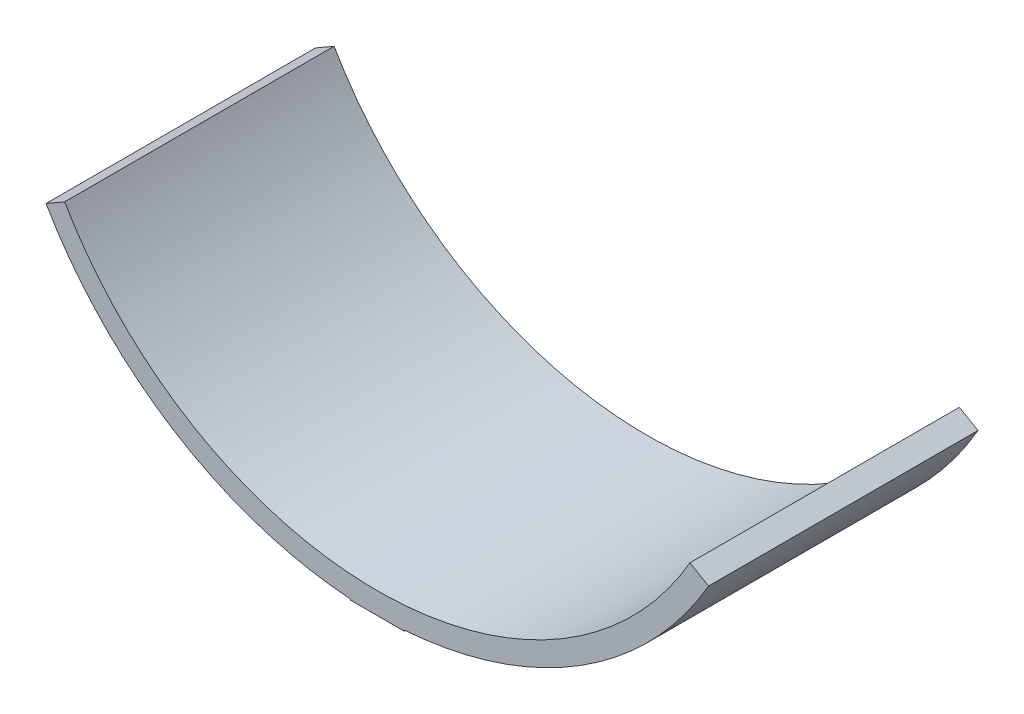
ISO-10303-21;
HEADER;
FILE_DESCRIPTION(('STEP AP214'),'2;1');
FILE_NAME('part.step','',(''),(''),'','','');
FILE_SCHEMA(('AUTOMOTIVE_DESIGN { 1 0 10303 214 1 1 1 1 }'));
ENDSEC;
DATA;
#1=APPLICATION_CONTEXT('core data for automotive mechanical design processes');
#2=APPLICATION_PROTOCOL_DEFINITION('international standard','automotive_design',2000,#1);
#3=PRODUCT_CONTEXT('',#1,'mechanical');
#4=PRODUCT('Part','Part','',(#3));
#5=PRODUCT_RELATED_PRODUCT_CATEGORY('part','',(#4));
#6=PRODUCT_DEFINITION_FORMATION('','',#4);
#7=PRODUCT_DEFINITION_CONTEXT('part definition',#1,'design');
#8=PRODUCT_DEFINITION('design','',#6,#7);
#9=PRODUCT_DEFINITION_SHAPE('','',#8);
#10=(LENGTH_UNIT() NAMED_UNIT(*) SI_UNIT(.MILLI.,.METRE.));
#11=(NAMED_UNIT(*) PLANE_ANGLE_UNIT() SI_UNIT($,.RADIAN.));
#12=(NAMED_UNIT(*) SI_UNIT($,.STERADIAN.) SOLID_ANGLE_UNIT());
#13=UNCERTAINTY_MEASURE_WITH_UNIT(LENGTH_MEASURE(1.E-05),#10,'distance_accuracy_value','');
#14=(GEOMETRIC_REPRESENTATION_CONTEXT(3) GLOBAL_UNCERTAINTY_ASSIGNED_CONTEXT((#13)) GLOBAL_UNIT_ASSIGNED_CONTEXT((#10,
#11,#12)) REPRESENTATION_CONTEXT('',''));
#15=CARTESIAN_POINT('',(0.,0.,0.));
#16=DIRECTION('',(0.,0.,1.));
#17=DIRECTION('',(1.,0.,0.));
#18=AXIS2_PLACEMENT_3D('',#15,#16,#17);
#19=CARTESIAN_POINT('',(0.,87.63,63.5));
#20=DIRECTION('',(0.,0.,-1.));
#21=DIRECTION('',(-1.,0.,0.));
#22=AXIS2_PLACEMENT_3D('',#19,#20,#21);
#23=CYLINDRICAL_SURFACE('',#22,85.09);
#24=CARTESIAN_POINT('',(0.,87.63,0.));
#25=DIRECTION('',(0.,0.,1.));
#26=DIRECTION('',(1.,0.,0.));
#27=AXIS2_PLACEMENT_3D('',#24,#25,#26);
#28=CIRCLE('',#27,85.09);
#29=CARTESIAN_POINT('',(-73.6901016080177,45.0849999999996,0.));
#30=VERTEX_POINT('',#29);
#31=CARTESIAN_POINT('',(73.6901016080177,45.0849999999997,0.));
#32=VERTEX_POINT('',#31);
#33=EDGE_CURVE('E155',#30,#32,#28,.T.);
#34=ORIENTED_EDGE('',*,*,#33,.F.);
#35=DIRECTION('',(0.,0.,-1.));
#36=VECTOR('',#35,1.);
#37=CARTESIAN_POINT('',(-73.6901016080177,45.0849999999996,63.5));
#38=LINE('',#37,#36);
#39=CARTESIAN_POINT('',(-73.6901016080177,45.0849999999996,63.5));
#40=VERTEX_POINT('',#39);
#41=EDGE_CURVE('E11',#40,#30,#38,.T.);
#42=ORIENTED_EDGE('',*,*,#41,.F.);
#43=CARTESIAN_POINT('',(0.,87.63,63.5));
#44=DIRECTION('',(0.,0.,1.));
#45=DIRECTION('',(1.,0.,0.));
#46=AXIS2_PLACEMENT_3D('',#43,#44,#45);
#47=CIRCLE('',#46,85.09);
#48=CARTESIAN_POINT('',(73.6901016080177,45.0849999999997,63.5));
#49=VERTEX_POINT('',#48);
#50=EDGE_CURVE('E182',#40,#49,#47,.T.);
#51=ORIENTED_EDGE('',*,*,#50,.T.);
#52=DIRECTION('',(0.,0.,-1.));
#53=VECTOR('',#52,1.);
#54=CARTESIAN_POINT('',(73.6901016080177,45.0849999999997,63.5));
#55=LINE('',#54,#53);
#56=EDGE_CURVE('E100',#49,#32,#55,.T.);
#57=ORIENTED_EDGE('',*,*,#56,.T.);
#58=EDGE_LOOP('',(#34,#42,#51,#57));
#59=FACE_BOUND('',#58,.T.);
#60=ADVANCED_FACE('F44',(#59),#23,.F.);
#61=CARTESIAN_POINT('',(-37.9449030668156,65.7224999999996,63.5));
#62=DIRECTION('',(0.500000000000007,-0.866025403784435,0.));
#63=DIRECTION('',(0.866025403784435,0.500000000000007,0.));
#64=AXIS2_PLACEMENT_3D('',#61,#62,#63);
#65=PLANE('',#64);
#66=DIRECTION('',(-0.866025403784435,-0.500000000000007,0.));
#67=VECTOR('',#66,1.);
#68=CARTESIAN_POINT('',(-37.9449030668156,65.7224999999996,0.));
#69=LINE('',#68,#67);
#70=CARTESIAN_POINT('',(-78.0895106592426,42.5449999999996,0.));
#71=VERTEX_POINT('',#70);
#72=EDGE_CURVE('E159',#30,#71,#69,.T.);
#73=ORIENTED_EDGE('',*,*,#72,.T.);
#74=DIRECTION('',(0.,0.,-1.));
#75=VECTOR('',#74,1.);
#76=CARTESIAN_POINT('',(-78.0895106592426,42.5449999999996,63.5));
#77=LINE('',#76,#75);
#78=CARTESIAN_POINT('',(-78.0895106592426,42.5449999999996,63.5));
#79=VERTEX_POINT('',#78);
#80=EDGE_CURVE('E52',#79,#71,#77,.T.);
#81=ORIENTED_EDGE('',*,*,#80,.F.);
#82=DIRECTION('',(-0.866025403784435,-0.500000000000007,0.));
#83=VECTOR('',#82,1.);
#84=CARTESIAN_POINT('',(-37.9449030668156,65.7224999999996,63.5));
#85=LINE('',#84,#83);
#86=EDGE_CURVE('E217',#40,#79,#85,.T.);
#87=ORIENTED_EDGE('',*,*,#86,.F.);
#88=ORIENTED_EDGE('',*,*,#41,.T.);
#89=EDGE_LOOP('',(#73,#81,#87,#88));
#90=FACE_BOUND('',#89,.T.);
#91=ADVANCED_FACE('F308',(#90),#65,.F.);
#92=CARTESIAN_POINT('',(0.,87.63,63.5));
#93=DIRECTION('',(0.,0.,-1.));
#94=DIRECTION('',(-1.,0.,0.));
#95=AXIS2_PLACEMENT_3D('',#92,#93,#94);
#96=CYLINDRICAL_SURFACE('',#95,90.17);
#97=CARTESIAN_POINT('',(0.,87.63,0.));
#98=DIRECTION('',(0.,0.,1.));
#99=DIRECTION('',(1.,0.,0.));
#100=AXIS2_PLACEMENT_3D('',#97,#98,#99);
#101=CIRCLE('',#100,90.17);
#102=CARTESIAN_POINT('',(-6.35,-2.31613054489893,0.));
#103=VERTEX_POINT('',#102);
#104=EDGE_CURVE('E163',#71,#103,#101,.T.);
#105=ORIENTED_EDGE('',*,*,#104,.T.);
#106=DIRECTION('',(0.,0.,-1.));
#107=VECTOR('',#106,1.);
#108=CARTESIAN_POINT('',(-6.35,-2.31613054489893,63.5));
#109=LINE('',#108,#107);
#110=CARTESIAN_POINT('',(-6.35,-2.31613054489893,63.5));
#111=VERTEX_POINT('',#110);
#112=EDGE_CURVE('E192',#111,#103,#109,.T.);
#113=ORIENTED_EDGE('',*,*,#112,.F.);
#114=CARTESIAN_POINT('',(0.,87.63,63.5));
#115=DIRECTION('',(0.,0.,1.));
#116=DIRECTION('',(1.,0.,0.));
#117=AXIS2_PLACEMENT_3D('',#114,#115,#116);
#118=CIRCLE('',#117,90.17);
#119=EDGE_CURVE('E202',#79,#111,#118,.T.);
#120=ORIENTED_EDGE('',*,*,#119,.F.);
#121=ORIENTED_EDGE('',*,*,#80,.T.);
#122=EDGE_LOOP('',(#105,#113,#120,#121));
#123=FACE_BOUND('',#122,.T.);
#124=ADVANCED_FACE('F200',(#123),#96,.T.);
#125=CARTESIAN_POINT('',(-6.35,0.,63.5));
#126=DIRECTION('',(-1.,0.,0.));
#127=DIRECTION('',(0.,0.,1.));
#128=AXIS2_PLACEMENT_3D('',#125,#126,#127);
#129=PLANE('',#128);
#130=DIRECTION('',(0.,1.,0.));
#131=VECTOR('',#130,1.);
#132=CARTESIAN_POINT('',(-6.35,0.,0.));
#133=LINE('',#132,#131);
#134=CARTESIAN_POINT('',(-6.35,-2.54,0.));
#135=VERTEX_POINT('',#134);
#136=EDGE_CURVE('E167',#135,#103,#133,.T.);
#137=ORIENTED_EDGE('',*,*,#136,.F.);
#138=DIRECTION('',(0.,0.,-1.));
#139=VECTOR('',#138,1.);
#140=CARTESIAN_POINT('',(-6.35,-2.54,63.5));
#141=LINE('',#140,#139);
#142=CARTESIAN_POINT('',(-6.35,-2.54,63.5));
#143=VERTEX_POINT('',#142);
#144=EDGE_CURVE('E189',#143,#135,#141,.T.);
#145=ORIENTED_EDGE('',*,*,#144,.F.);
#146=DIRECTION('',(0.,1.,0.));
#147=VECTOR('',#146,1.);
#148=CARTESIAN_POINT('',(-6.35,0.,63.5));
#149=LINE('',#148,#147);
#150=EDGE_CURVE('E212',#143,#111,#149,.T.);
#151=ORIENTED_EDGE('',*,*,#150,.T.);
#152=ORIENTED_EDGE('',*,*,#112,.T.);
#153=EDGE_LOOP('',(#137,#145,#151,#152));
#154=FACE_BOUND('',#153,.T.);
#155=ADVANCED_FACE('F210',(#154),#129,.T.);
#156=CARTESIAN_POINT('',(0.,-2.54,63.5));
#157=DIRECTION('',(0.,1.,0.));
#158=DIRECTION('',(0.,0.,1.));
#159=AXIS2_PLACEMENT_3D('',#156,#157,#158);
#160=PLANE('',#159);
#161=DIRECTION('',(-1.,0.,0.));
#162=VECTOR('',#161,1.);
#163=CARTESIAN_POINT('',(-2.5527,-2.54,56.007));
#164=LINE('',#163,#162);
#165=CARTESIAN_POINT('',(2.7813,-2.54,56.007));
#166=VERTEX_POINT('',#165);
#167=CARTESIAN_POINT('',(-2.5527,-2.54,56.007));
#168=VERTEX_POINT('',#167);
#169=EDGE_CURVE('E247',#166,#168,#164,.T.);
#170=ORIENTED_EDGE('',*,*,#169,.F.);
#171=DIRECTION('',(0.,0.,1.));
#172=VECTOR('',#171,1.);
#173=CARTESIAN_POINT('',(2.7813,-2.54,25.273));
#174=LINE('',#173,#172);
#175=CARTESIAN_POINT('',(2.7813,-2.54,25.273));
#176=VERTEX_POINT('',#175);
#177=EDGE_CURVE('E59',#176,#166,#174,.T.);
#178=ORIENTED_EDGE('',*,*,#177,.F.);
#179=DIRECTION('',(1.,0.,0.));
#180=VECTOR('',#179,1.);
#181=CARTESIAN_POINT('',(-2.5527,-2.54,25.273));
#182=LINE('',#181,#180);
#183=CARTESIAN_POINT('',(-2.5527,-2.54,25.273));
#184=VERTEX_POINT('',#183);
#185=EDGE_CURVE('E238',#184,#176,#182,.T.);
#186=ORIENTED_EDGE('',*,*,#185,.F.);
#187=DIRECTION('',(0.,0.,-1.));
#188=VECTOR('',#187,1.);
#189=CARTESIAN_POINT('',(-2.5527,-2.54,25.273));
#190=LINE('',#189,#188);
#191=EDGE_CURVE('E243',#168,#184,#190,.T.);
#192=ORIENTED_EDGE('',*,*,#191,.F.);
#193=EDGE_LOOP('',(#170,#178,#186,#192));
#194=FACE_BOUND('',#193,.T.);
#195=DIRECTION('',(1.,0.,0.));
#196=VECTOR('',#195,1.);
#197=CARTESIAN_POINT('',(0.,-2.54,0.));
#198=LINE('',#197,#196);
#199=CARTESIAN_POINT('',(6.35,-2.54,0.));
#200=VERTEX_POINT('',#199);
#201=EDGE_CURVE('E171',#135,#200,#198,.T.);
#202=ORIENTED_EDGE('',*,*,#201,.T.);
#203=DIRECTION('',(0.,0.,-1.));
#204=VECTOR('',#203,1.);
#205=CARTESIAN_POINT('',(6.35,-2.54,63.5));
#206=LINE('',#205,#204);
#207=CARTESIAN_POINT('',(6.35,-2.54,63.5));
#208=VERTEX_POINT('',#207);
#209=EDGE_CURVE('E144',#208,#200,#206,.T.);
#210=ORIENTED_EDGE('',*,*,#209,.F.);
#211=DIRECTION('',(1.,0.,0.));
#212=VECTOR('',#211,1.);
#213=CARTESIAN_POINT('',(0.,-2.54,63.5));
#214=LINE('',#213,#212);
#215=EDGE_CURVE('E130',#143,#208,#214,.T.);
#216=ORIENTED_EDGE('',*,*,#215,.F.);
#217=ORIENTED_EDGE('',*,*,#144,.T.);
#218=EDGE_LOOP('',(#202,#210,#216,#217));
#219=FACE_BOUND('',#218,.T.);
#220=ADVANCED_FACE('F294',(#194,#219),#160,.F.);
#221=CARTESIAN_POINT('',(6.35,0.,63.5));
#222=DIRECTION('',(-1.,0.,0.));
#223=DIRECTION('',(0.,0.,1.));
#224=AXIS2_PLACEMENT_3D('',#221,#222,#223);
#225=PLANE('',#224);
#226=DIRECTION('',(0.,1.,0.));
#227=VECTOR('',#226,1.);
#228=CARTESIAN_POINT('',(6.35,0.,0.));
#229=LINE('',#228,#227);
#230=CARTESIAN_POINT('',(6.35,-2.31613054489893,0.));
#231=VERTEX_POINT('',#230);
#232=EDGE_CURVE('E140',#200,#231,#229,.T.);
#233=ORIENTED_EDGE('',*,*,#232,.T.);
#234=DIRECTION('',(0.,0.,-1.));
#235=VECTOR('',#234,1.);
#236=CARTESIAN_POINT('',(6.35,-2.31613054489893,63.5));
#237=LINE('',#236,#235);
#238=CARTESIAN_POINT('',(6.35,-2.31613054489893,63.5));
#239=VERTEX_POINT('',#238);
#240=EDGE_CURVE('E137',#239,#231,#237,.T.);
#241=ORIENTED_EDGE('',*,*,#240,.F.);
#242=DIRECTION('',(0.,1.,0.));
#243=VECTOR('',#242,1.);
#244=CARTESIAN_POINT('',(6.35,0.,63.5));
#245=LINE('',#244,#243);
#246=EDGE_CURVE('E122',#208,#239,#245,.T.);
#247=ORIENTED_EDGE('',*,*,#246,.F.);
#248=ORIENTED_EDGE('',*,*,#209,.T.);
#249=EDGE_LOOP('',(#233,#241,#247,#248));
#250=FACE_BOUND('',#249,.T.);
#251=ADVANCED_FACE('F138',(#250),#225,.F.);
#252=CARTESIAN_POINT('',(0.,87.63,63.5));
#253=DIRECTION('',(0.,0.,-1.));
#254=DIRECTION('',(-1.,0.,0.));
#255=AXIS2_PLACEMENT_3D('',#252,#253,#254);
#256=CYLINDRICAL_SURFACE('',#255,90.17);
#257=CARTESIAN_POINT('',(0.,87.63,0.));
#258=DIRECTION('',(0.,0.,1.));
#259=DIRECTION('',(1.,0.,0.));
#260=AXIS2_PLACEMENT_3D('',#257,#258,#259);
#261=CIRCLE('',#260,90.17);
#262=CARTESIAN_POINT('',(78.0895106592426,42.5449999999996,0.));
#263=VERTEX_POINT('',#262);
#264=EDGE_CURVE('E176',#231,#263,#261,.T.);
#265=ORIENTED_EDGE('',*,*,#264,.T.);
#266=DIRECTION('',(0.,0.,-1.));
#267=VECTOR('',#266,1.);
#268=CARTESIAN_POINT('',(78.0895106592426,42.5449999999996,63.5));
#269=LINE('',#268,#267);
#270=CARTESIAN_POINT('',(78.0895106592426,42.5449999999996,63.5));
#271=VERTEX_POINT('',#270);
#272=EDGE_CURVE('E145',#271,#263,#269,.T.);
#273=ORIENTED_EDGE('',*,*,#272,.F.);
#274=CARTESIAN_POINT('',(0.,87.63,63.5));
#275=DIRECTION('',(0.,0.,1.));
#276=DIRECTION('',(1.,0.,0.));
#277=AXIS2_PLACEMENT_3D('',#274,#275,#276);
#278=CIRCLE('',#277,90.17);
#279=EDGE_CURVE('E126',#239,#271,#278,.T.);
#280=ORIENTED_EDGE('',*,*,#279,.F.);
#281=ORIENTED_EDGE('',*,*,#240,.T.);
#282=EDGE_LOOP('',(#265,#273,#280,#281));
#283=FACE_BOUND('',#282,.T.);
#284=ADVANCED_FACE('F147',(#283),#256,.T.);
#285=CARTESIAN_POINT('',(37.9449030668157,65.7224999999997,63.5));
#286=DIRECTION('',(-0.500000000000007,-0.866025403784434,0.));
#287=DIRECTION('',(0.866025403784434,-0.500000000000007,0.));
#288=AXIS2_PLACEMENT_3D('',#285,#286,#287);
#289=PLANE('',#288);
#290=DIRECTION('',(-0.866025403784434,0.500000000000007,0.));
#291=VECTOR('',#290,1.);
#292=CARTESIAN_POINT('',(37.9449030668157,65.7224999999997,0.));
#293=LINE('',#292,#291);
#294=EDGE_CURVE('E179',#263,#32,#293,.T.);
#295=ORIENTED_EDGE('',*,*,#294,.T.);
#296=ORIENTED_EDGE('',*,*,#56,.F.);
#297=DIRECTION('',(-0.866025403784434,0.500000000000007,0.));
#298=VECTOR('',#297,1.);
#299=CARTESIAN_POINT('',(37.9449030668157,65.7224999999997,63.5));
#300=LINE('',#299,#298);
#301=EDGE_CURVE('E68',#271,#49,#300,.T.);
#302=ORIENTED_EDGE('',*,*,#301,.F.);
#303=ORIENTED_EDGE('',*,*,#272,.T.);
#304=EDGE_LOOP('',(#295,#296,#302,#303));
#305=FACE_BOUND('',#304,.T.);
#306=ADVANCED_FACE('F314',(#305),#289,.F.);
#307=CARTESIAN_POINT('',(0.,0.,63.5));
#308=DIRECTION('',(0.,0.,1.));
#309=DIRECTION('',(1.,0.,0.));
#310=AXIS2_PLACEMENT_3D('',#307,#308,#309);
#311=PLANE('',#310);
#312=ORIENTED_EDGE('',*,*,#50,.F.);
#313=ORIENTED_EDGE('',*,*,#86,.T.);
#314=ORIENTED_EDGE('',*,*,#119,.T.);
#315=ORIENTED_EDGE('',*,*,#150,.F.);
#316=ORIENTED_EDGE('',*,*,#215,.T.);
#317=ORIENTED_EDGE('',*,*,#246,.T.);
#318=ORIENTED_EDGE('',*,*,#279,.T.);
#319=ORIENTED_EDGE('',*,*,#301,.T.);
#320=EDGE_LOOP('',(#312,#313,#314,#315,#316,#317,#318,#319));
#321=FACE_BOUND('',#320,.T.);
#322=ADVANCED_FACE('F124',(#321),#311,.T.);
#323=CARTESIAN_POINT('',(0.,0.,0.));
#324=DIRECTION('',(0.,0.,1.));
#325=DIRECTION('',(1.,0.,0.));
#326=AXIS2_PLACEMENT_3D('',#323,#324,#325);
#327=PLANE('',#326);
#328=ORIENTED_EDGE('',*,*,#33,.T.);
#329=ORIENTED_EDGE('',*,*,#294,.F.);
#330=ORIENTED_EDGE('',*,*,#264,.F.);
#331=ORIENTED_EDGE('',*,*,#232,.F.);
#332=ORIENTED_EDGE('',*,*,#201,.F.);
#333=ORIENTED_EDGE('',*,*,#136,.T.);
#334=ORIENTED_EDGE('',*,*,#104,.F.);
#335=ORIENTED_EDGE('',*,*,#72,.F.);
#336=EDGE_LOOP('',(#328,#329,#330,#331,#332,#333,#334,#335));
#337=FACE_BOUND('',#336,.T.);
#338=ADVANCED_FACE('F206',(#337),#327,.F.);
#339=CARTESIAN_POINT('',(2.7813,0.634999999999997,25.273));
#340=DIRECTION('',(1.,0.,0.));
#341=DIRECTION('',(0.,0.,-1.));
#342=AXIS2_PLACEMENT_3D('',#339,#340,#341);
#343=PLANE('',#342);
#344=ORIENTED_EDGE('',*,*,#177,.T.);
#345=DIRECTION('',(0.,-1.,0.));
#346=VECTOR('',#345,1.);
#347=CARTESIAN_POINT('',(2.7813,0.634999999999997,56.007));
#348=LINE('',#347,#346);
#349=CARTESIAN_POINT('',(2.7813,0.634999999999997,56.007));
#350=VERTEX_POINT('',#349);
#351=EDGE_CURVE('E224',#350,#166,#348,.T.);
#352=ORIENTED_EDGE('',*,*,#351,.F.);
#353=DIRECTION('',(0.,0.,1.));
#354=VECTOR('',#353,1.);
#355=CARTESIAN_POINT('',(2.7813,0.634999999999997,25.273));
#356=LINE('',#355,#354);
#357=CARTESIAN_POINT('',(2.7813,0.634999999999997,25.273));
#358=VERTEX_POINT('',#357);
#359=EDGE_CURVE('E242',#358,#350,#356,.T.);
#360=ORIENTED_EDGE('',*,*,#359,.F.);
#361=DIRECTION('',(0.,-1.,0.));
#362=VECTOR('',#361,1.);
#363=CARTESIAN_POINT('',(2.7813,0.634999999999997,25.273));
#364=LINE('',#363,#362);
#365=EDGE_CURVE('E160',#358,#176,#364,.T.);
#366=ORIENTED_EDGE('',*,*,#365,.T.);
#367=EDGE_LOOP('',(#344,#352,#360,#366));
#368=FACE_BOUND('',#367,.T.);
#369=ADVANCED_FACE('F274',(#368),#343,.F.);
#370=CARTESIAN_POINT('',(-2.5527,0.634999999999997,25.273));
#371=DIRECTION('',(0.,0.,-1.));
#372=DIRECTION('',(-1.,0.,0.));
#373=AXIS2_PLACEMENT_3D('',#370,#371,#372);
#374=PLANE('',#373);
#375=ORIENTED_EDGE('',*,*,#185,.T.);
#376=ORIENTED_EDGE('',*,*,#365,.F.);
#377=DIRECTION('',(1.,0.,0.));
#378=VECTOR('',#377,1.);
#379=CARTESIAN_POINT('',(-2.5527,0.634999999999997,25.273));
#380=LINE('',#379,#378);
#381=CARTESIAN_POINT('',(-2.5527,0.634999999999997,25.273));
#382=VERTEX_POINT('',#381);
#383=EDGE_CURVE('E228',#382,#358,#380,.T.);
#384=ORIENTED_EDGE('',*,*,#383,.F.);
#385=DIRECTION('',(0.,-1.,0.));
#386=VECTOR('',#385,1.);
#387=CARTESIAN_POINT('',(-2.5527,0.634999999999997,25.273));
#388=LINE('',#387,#386);
#389=EDGE_CURVE('E232',#382,#184,#388,.T.);
#390=ORIENTED_EDGE('',*,*,#389,.T.);
#391=EDGE_LOOP('',(#375,#376,#384,#390));
#392=FACE_BOUND('',#391,.T.);
#393=ADVANCED_FACE('F285',(#392),#374,.F.);
#394=CARTESIAN_POINT('',(-2.5527,0.634999999999997,25.273));
#395=DIRECTION('',(-1.,0.,0.));
#396=DIRECTION('',(0.,0.,1.));
#397=AXIS2_PLACEMENT_3D('',#394,#395,#396);
#398=PLANE('',#397);
#399=ORIENTED_EDGE('',*,*,#191,.T.);
#400=ORIENTED_EDGE('',*,*,#389,.F.);
#401=DIRECTION('',(0.,0.,-1.));
#402=VECTOR('',#401,1.);
#403=CARTESIAN_POINT('',(-2.5527,0.634999999999997,25.273));
#404=LINE('',#403,#402);
#405=CARTESIAN_POINT('',(-2.5527,0.634999999999997,56.007));
#406=VERTEX_POINT('',#405);
#407=EDGE_CURVE('E256',#406,#382,#404,.T.);
#408=ORIENTED_EDGE('',*,*,#407,.F.);
#409=DIRECTION('',(0.,-1.,0.));
#410=VECTOR('',#409,1.);
#411=CARTESIAN_POINT('',(-2.5527,0.634999999999997,56.007));
#412=LINE('',#411,#410);
#413=EDGE_CURVE('E227',#406,#168,#412,.T.);
#414=ORIENTED_EDGE('',*,*,#413,.T.);
#415=EDGE_LOOP('',(#399,#400,#408,#414));
#416=FACE_BOUND('',#415,.T.);
#417=ADVANCED_FACE('F290',(#416),#398,.F.);
#418=CARTESIAN_POINT('',(-2.5527,0.634999999999997,56.007));
#419=DIRECTION('',(0.,0.,1.));
#420=DIRECTION('',(1.,0.,0.));
#421=AXIS2_PLACEMENT_3D('',#418,#419,#420);
#422=PLANE('',#421);
#423=ORIENTED_EDGE('',*,*,#169,.T.);
#424=ORIENTED_EDGE('',*,*,#413,.F.);
#425=DIRECTION('',(-1.,0.,0.));
#426=VECTOR('',#425,1.);
#427=CARTESIAN_POINT('',(-2.5527,0.634999999999997,56.007));
#428=LINE('',#427,#426);
#429=EDGE_CURVE('E260',#350,#406,#428,.T.);
#430=ORIENTED_EDGE('',*,*,#429,.F.);
#431=ORIENTED_EDGE('',*,*,#351,.T.);
#432=EDGE_LOOP('',(#423,#424,#430,#431));
#433=FACE_BOUND('',#432,.T.);
#434=ADVANCED_FACE('F297',(#433),#422,.F.);
#435=CARTESIAN_POINT('',(0.,0.634999999999997,0.));
#436=DIRECTION('',(0.,1.,0.));
#437=DIRECTION('',(0.,0.,1.));
#438=AXIS2_PLACEMENT_3D('',#435,#436,#437);
#439=PLANE('',#438);
#440=ORIENTED_EDGE('',*,*,#359,.T.);
#441=ORIENTED_EDGE('',*,*,#429,.T.);
#442=ORIENTED_EDGE('',*,*,#407,.T.);
#443=ORIENTED_EDGE('',*,*,#383,.T.);
#444=EDGE_LOOP('',(#440,#441,#442,#443));
#445=FACE_BOUND('',#444,.T.);
#446=ADVANCED_FACE('F269',(#445),#439,.F.);
#447=CLOSED_SHELL('',(#60,#91,#124,#155,#220,#251,#284,#306,#322,#338,#369,#393,#417,#434,#446));
#448=MANIFOLD_SOLID_BREP('B2',#447);
#449=ADVANCED_BREP_SHAPE_REPRESENTATION('',(#18,#448),#14);
#450=SHAPE_DEFINITION_REPRESENTATION(#9,#449);
ENDSEC;
END-ISO-10303-21;
